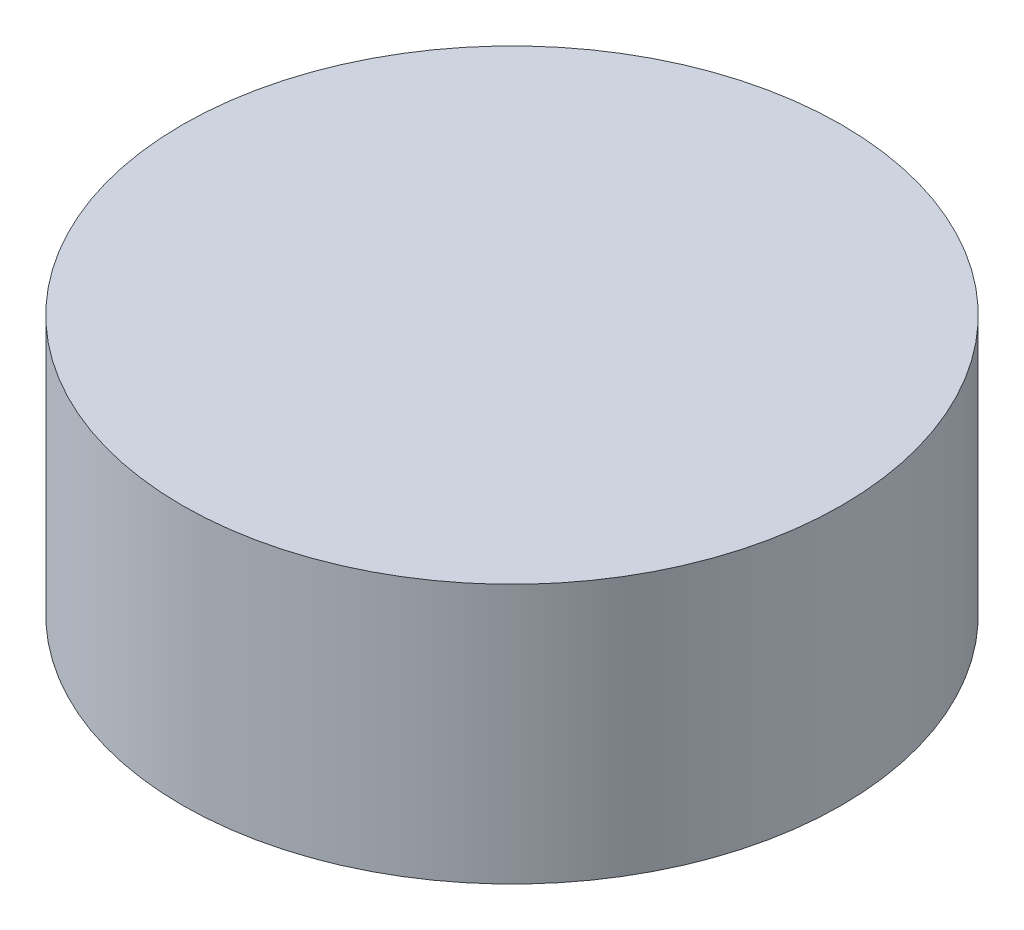
ISO-10303-21;
HEADER;
FILE_DESCRIPTION(('STEP AP214'),'2;1');
FILE_NAME('part.step','',(''),(''),'','','');
FILE_SCHEMA(('AUTOMOTIVE_DESIGN { 1 0 10303 214 1 1 1 1 }'));
ENDSEC;
DATA;
#1=APPLICATION_CONTEXT('core data for automotive mechanical design processes');
#2=APPLICATION_PROTOCOL_DEFINITION('international standard','automotive_design',2000,#1);
#3=PRODUCT_CONTEXT('',#1,'mechanical');
#4=PRODUCT('Part','Part','',(#3));
#5=PRODUCT_RELATED_PRODUCT_CATEGORY('part','',(#4));
#6=PRODUCT_DEFINITION_FORMATION('','',#4);
#7=PRODUCT_DEFINITION_CONTEXT('part definition',#1,'design');
#8=PRODUCT_DEFINITION('design','',#6,#7);
#9=PRODUCT_DEFINITION_SHAPE('','',#8);
#10=(LENGTH_UNIT() NAMED_UNIT(*) SI_UNIT(.MILLI.,.METRE.));
#11=(NAMED_UNIT(*) PLANE_ANGLE_UNIT() SI_UNIT($,.RADIAN.));
#12=(NAMED_UNIT(*) SI_UNIT($,.STERADIAN.) SOLID_ANGLE_UNIT());
#13=UNCERTAINTY_MEASURE_WITH_UNIT(LENGTH_MEASURE(1.E-05),#10,'distance_accuracy_value','');
#14=(GEOMETRIC_REPRESENTATION_CONTEXT(3) GLOBAL_UNCERTAINTY_ASSIGNED_CONTEXT((#13)) GLOBAL_UNIT_ASSIGNED_CONTEXT((#10,
#11,#12)) REPRESENTATION_CONTEXT('',''));
#15=CARTESIAN_POINT('',(0.,0.,0.));
#16=DIRECTION('',(0.,0.,1.));
#17=DIRECTION('',(1.,0.,0.));
#18=AXIS2_PLACEMENT_3D('',#15,#16,#17);
#19=CARTESIAN_POINT('',(0.,5.,0.));
#20=DIRECTION('',(0.,-1.,0.));
#21=DIRECTION('',(0.,0.,-1.));
#22=AXIS2_PLACEMENT_3D('',#19,#20,#21);
#23=CYLINDRICAL_SURFACE('',#22,6.35);
#24=CARTESIAN_POINT('',(0.,5.,0.));
#25=DIRECTION('',(0.,1.,0.));
#26=DIRECTION('',(0.,0.,1.));
#27=AXIS2_PLACEMENT_3D('',#24,#25,#26);
#28=CIRCLE('',#27,6.35);
#29=CARTESIAN_POINT('',(0.,5.,6.35));
#30=VERTEX_POINT('',#29);
#31=EDGE_CURVE('E10',#30,#30,#28,.T.);
#32=ORIENTED_EDGE('',*,*,#31,.F.);
#33=EDGE_LOOP('',(#32));
#34=FACE_BOUND('',#33,.T.);
#35=CARTESIAN_POINT('',(0.,0.,0.));
#36=DIRECTION('',(0.,1.,0.));
#37=DIRECTION('',(0.,0.,1.));
#38=AXIS2_PLACEMENT_3D('',#35,#36,#37);
#39=CIRCLE('',#38,6.35);
#40=CARTESIAN_POINT('',(0.,0.,6.35));
#41=VERTEX_POINT('',#40);
#42=EDGE_CURVE('E40',#41,#41,#39,.T.);
#43=ORIENTED_EDGE('',*,*,#42,.T.);
#44=EDGE_LOOP('',(#43));
#45=FACE_BOUND('',#44,.T.);
#46=ADVANCED_FACE('F37',(#34,#45),#23,.T.);
#47=CARTESIAN_POINT('',(0.,5.,0.));
#48=DIRECTION('',(0.,1.,0.));
#49=DIRECTION('',(0.,0.,1.));
#50=AXIS2_PLACEMENT_3D('',#47,#48,#49);
#51=PLANE('',#50);
#52=ORIENTED_EDGE('',*,*,#31,.T.);
#53=EDGE_LOOP('',(#52));
#54=FACE_BOUND('',#53,.T.);
#55=ADVANCED_FACE('F54',(#54),#51,.T.);
#56=CARTESIAN_POINT('',(0.,0.,0.));
#57=DIRECTION('',(0.,1.,0.));
#58=DIRECTION('',(0.,0.,1.));
#59=AXIS2_PLACEMENT_3D('',#56,#57,#58);
#60=PLANE('',#59);
#61=ORIENTED_EDGE('',*,*,#42,.F.);
#62=EDGE_LOOP('',(#61));
#63=FACE_BOUND('',#62,.T.);
#64=ADVANCED_FACE('F52',(#63),#60,.F.);
#65=CLOSED_SHELL('',(#46,#55,#64));
#66=MANIFOLD_SOLID_BREP('B2',#65);
#67=ADVANCED_BREP_SHAPE_REPRESENTATION('',(#18,#66),#14);
#68=SHAPE_DEFINITION_REPRESENTATION(#9,#67);
ENDSEC;
END-ISO-10303-21;
